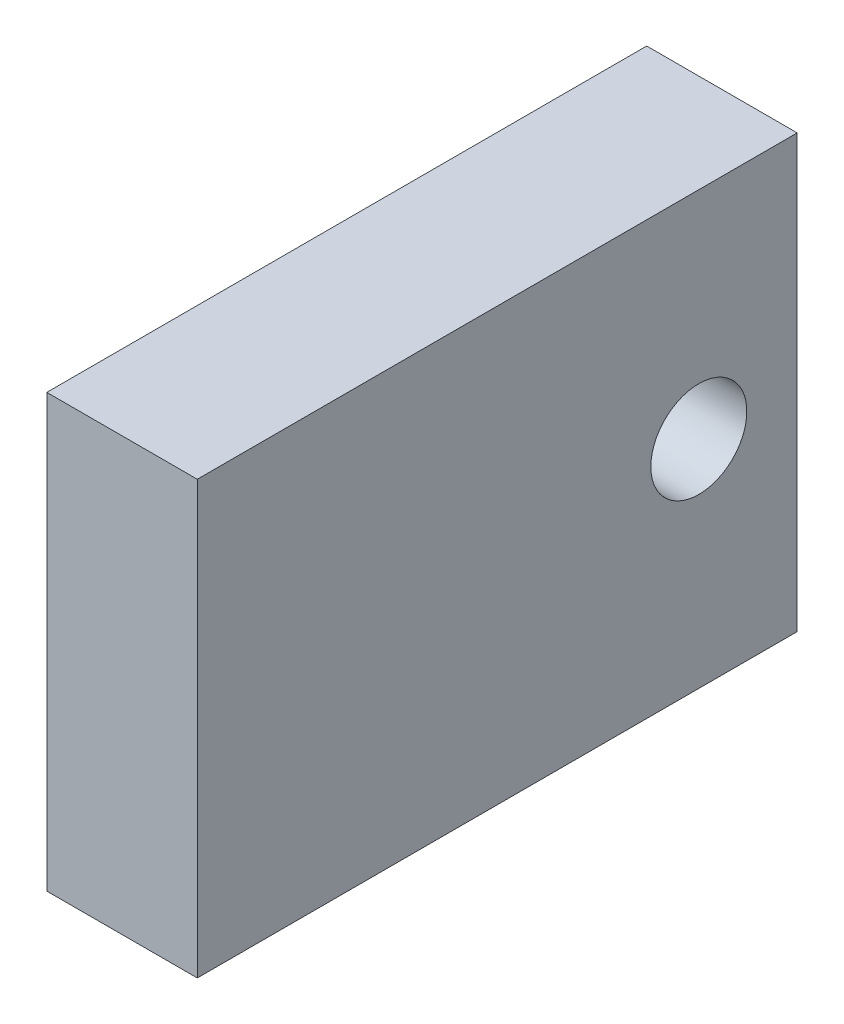
ISO-10303-21;
HEADER;
FILE_DESCRIPTION(('STEP AP214'),'2;1');
FILE_NAME('part.step','',(''),(''),'','','');
FILE_SCHEMA(('AUTOMOTIVE_DESIGN { 1 0 10303 214 1 1 1 1 }'));
ENDSEC;
DATA;
#1=APPLICATION_CONTEXT('core data for automotive mechanical design processes');
#2=APPLICATION_PROTOCOL_DEFINITION('international standard','automotive_design',2000,#1);
#3=PRODUCT_CONTEXT('',#1,'mechanical');
#4=PRODUCT('Part','Part','',(#3));
#5=PRODUCT_RELATED_PRODUCT_CATEGORY('part','',(#4));
#6=PRODUCT_DEFINITION_FORMATION('','',#4);
#7=PRODUCT_DEFINITION_CONTEXT('part definition',#1,'design');
#8=PRODUCT_DEFINITION('design','',#6,#7);
#9=PRODUCT_DEFINITION_SHAPE('','',#8);
#10=(LENGTH_UNIT() NAMED_UNIT(*) SI_UNIT(.MILLI.,.METRE.));
#11=(NAMED_UNIT(*) PLANE_ANGLE_UNIT() SI_UNIT($,.RADIAN.));
#12=(NAMED_UNIT(*) SI_UNIT($,.STERADIAN.) SOLID_ANGLE_UNIT());
#13=UNCERTAINTY_MEASURE_WITH_UNIT(LENGTH_MEASURE(1.E-05),#10,'distance_accuracy_value','');
#14=(GEOMETRIC_REPRESENTATION_CONTEXT(3) GLOBAL_UNCERTAINTY_ASSIGNED_CONTEXT((#13)) GLOBAL_UNIT_ASSIGNED_CONTEXT((#10,
#11,#12)) REPRESENTATION_CONTEXT('',''));
#15=CARTESIAN_POINT('',(0.,0.,0.));
#16=DIRECTION('',(0.,0.,1.));
#17=DIRECTION('',(1.,0.,0.));
#18=AXIS2_PLACEMENT_3D('',#15,#16,#17);
#19=CARTESIAN_POINT('',(-7.964493596,45.72,-31.75));
#20=DIRECTION('',(1.,0.,0.));
#21=DIRECTION('',(0.,0.,-1.));
#22=AXIS2_PLACEMENT_3D('',#19,#20,#21);
#23=PLANE('',#22);
#24=CARTESIAN_POINT('',(-7.964493596,22.86,-21.336));
#25=DIRECTION('',(-1.,0.,0.));
#26=DIRECTION('',(0.,0.,1.));
#27=AXIS2_PLACEMENT_3D('',#24,#25,#26);
#28=CIRCLE('',#27,5.08);
#29=CARTESIAN_POINT('',(-7.964493596,22.86,-16.256));
#30=VERTEX_POINT('',#29);
#31=EDGE_CURVE('E121',#30,#30,#28,.T.);
#32=ORIENTED_EDGE('',*,*,#31,.F.);
#33=EDGE_LOOP('',(#32));
#34=FACE_BOUND('',#33,.T.);
#35=DIRECTION('',(0.,0.,1.));
#36=VECTOR('',#35,1.);
#37=CARTESIAN_POINT('',(-7.964493596,0.,-31.75));
#38=LINE('',#37,#36);
#39=CARTESIAN_POINT('',(-7.964493596,0.,-31.75));
#40=VERTEX_POINT('',#39);
#41=CARTESIAN_POINT('',(-7.96449359599999,0.,31.75));
#42=VERTEX_POINT('',#41);
#43=EDGE_CURVE('E108',#40,#42,#38,.T.);
#44=ORIENTED_EDGE('',*,*,#43,.T.);
#45=DIRECTION('',(0.,-1.,0.));
#46=VECTOR('',#45,1.);
#47=CARTESIAN_POINT('',(-7.96449359599999,45.72,31.75));
#48=LINE('',#47,#46);
#49=CARTESIAN_POINT('',(-7.96449359599999,45.72,31.75));
#50=VERTEX_POINT('',#49);
#51=EDGE_CURVE('E11',#50,#42,#48,.T.);
#52=ORIENTED_EDGE('',*,*,#51,.F.);
#53=DIRECTION('',(0.,0.,1.));
#54=VECTOR('',#53,1.);
#55=CARTESIAN_POINT('',(-7.964493596,45.72,-31.75));
#56=LINE('',#55,#54);
#57=CARTESIAN_POINT('',(-7.964493596,45.72,-31.75));
#58=VERTEX_POINT('',#57);
#59=EDGE_CURVE('E95',#58,#50,#56,.T.);
#60=ORIENTED_EDGE('',*,*,#59,.F.);
#61=DIRECTION('',(0.,-1.,0.));
#62=VECTOR('',#61,1.);
#63=CARTESIAN_POINT('',(-7.964493596,45.72,-31.75));
#64=LINE('',#63,#62);
#65=EDGE_CURVE('E104',#58,#40,#64,.T.);
#66=ORIENTED_EDGE('',*,*,#65,.T.);
#67=EDGE_LOOP('',(#44,#52,#60,#66));
#68=FACE_BOUND('',#67,.T.);
#69=ADVANCED_FACE('F43',(#34,#68),#23,.F.);
#70=CARTESIAN_POINT('',(-7.96449359599999,45.72,31.75));
#71=DIRECTION('',(0.,0.,-1.));
#72=DIRECTION('',(-1.,0.,0.));
#73=AXIS2_PLACEMENT_3D('',#70,#71,#72);
#74=PLANE('',#73);
#75=DIRECTION('',(1.,0.,0.));
#76=VECTOR('',#75,1.);
#77=CARTESIAN_POINT('',(-7.96449359599999,0.,31.75));
#78=LINE('',#77,#76);
#79=CARTESIAN_POINT('',(7.964493596,0.,31.75));
#80=VERTEX_POINT('',#79);
#81=EDGE_CURVE('E99',#42,#80,#78,.T.);
#82=ORIENTED_EDGE('',*,*,#81,.T.);
#83=DIRECTION('',(0.,-1.,0.));
#84=VECTOR('',#83,1.);
#85=CARTESIAN_POINT('',(7.964493596,45.72,31.75));
#86=LINE('',#85,#84);
#87=CARTESIAN_POINT('',(7.964493596,45.72,31.75));
#88=VERTEX_POINT('',#87);
#89=EDGE_CURVE('E52',#88,#80,#86,.T.);
#90=ORIENTED_EDGE('',*,*,#89,.F.);
#91=DIRECTION('',(1.,0.,0.));
#92=VECTOR('',#91,1.);
#93=CARTESIAN_POINT('',(-7.96449359599999,45.72,31.75));
#94=LINE('',#93,#92);
#95=EDGE_CURVE('E90',#50,#88,#94,.T.);
#96=ORIENTED_EDGE('',*,*,#95,.F.);
#97=ORIENTED_EDGE('',*,*,#51,.T.);
#98=EDGE_LOOP('',(#82,#90,#96,#97));
#99=FACE_BOUND('',#98,.T.);
#100=ADVANCED_FACE('F98',(#99),#74,.F.);
#101=CARTESIAN_POINT('',(7.964493596,45.72,-31.75));
#102=DIRECTION('',(-1.,0.,0.));
#103=DIRECTION('',(0.,0.,1.));
#104=AXIS2_PLACEMENT_3D('',#101,#102,#103);
#105=PLANE('',#104);
#106=CARTESIAN_POINT('',(7.964493596,22.86,-21.336));
#107=DIRECTION('',(-1.,0.,0.));
#108=DIRECTION('',(0.,0.,1.));
#109=AXIS2_PLACEMENT_3D('',#106,#107,#108);
#110=CIRCLE('',#109,5.08);
#111=CARTESIAN_POINT('',(7.964493596,22.86,-16.256));
#112=VERTEX_POINT('',#111);
#113=EDGE_CURVE('E46',#112,#112,#110,.T.);
#114=ORIENTED_EDGE('',*,*,#113,.T.);
#115=EDGE_LOOP('',(#114));
#116=FACE_BOUND('',#115,.T.);
#117=DIRECTION('',(0.,0.,-1.));
#118=VECTOR('',#117,1.);
#119=CARTESIAN_POINT('',(7.964493596,0.,-31.75));
#120=LINE('',#119,#118);
#121=CARTESIAN_POINT('',(7.964493596,0.,-31.75));
#122=VERTEX_POINT('',#121);
#123=EDGE_CURVE('E77',#80,#122,#120,.T.);
#124=ORIENTED_EDGE('',*,*,#123,.T.);
#125=DIRECTION('',(0.,-1.,0.));
#126=VECTOR('',#125,1.);
#127=CARTESIAN_POINT('',(7.964493596,45.72,-31.75));
#128=LINE('',#127,#126);
#129=CARTESIAN_POINT('',(7.964493596,45.72,-31.75));
#130=VERTEX_POINT('',#129);
#131=EDGE_CURVE('E100',#130,#122,#128,.T.);
#132=ORIENTED_EDGE('',*,*,#131,.F.);
#133=DIRECTION('',(0.,0.,-1.));
#134=VECTOR('',#133,1.);
#135=CARTESIAN_POINT('',(7.964493596,45.72,-31.75));
#136=LINE('',#135,#134);
#137=EDGE_CURVE('E93',#88,#130,#136,.T.);
#138=ORIENTED_EDGE('',*,*,#137,.F.);
#139=ORIENTED_EDGE('',*,*,#89,.T.);
#140=EDGE_LOOP('',(#124,#132,#138,#139));
#141=FACE_BOUND('',#140,.T.);
#142=ADVANCED_FACE('F102',(#116,#141),#105,.F.);
#143=CARTESIAN_POINT('',(-7.964493596,45.72,-31.75));
#144=DIRECTION('',(0.,0.,1.));
#145=DIRECTION('',(1.,0.,0.));
#146=AXIS2_PLACEMENT_3D('',#143,#144,#145);
#147=PLANE('',#146);
#148=DIRECTION('',(-1.,0.,0.));
#149=VECTOR('',#148,1.);
#150=CARTESIAN_POINT('',(-7.964493596,0.,-31.75));
#151=LINE('',#150,#149);
#152=EDGE_CURVE('E83',#122,#40,#151,.T.);
#153=ORIENTED_EDGE('',*,*,#152,.T.);
#154=ORIENTED_EDGE('',*,*,#65,.F.);
#155=DIRECTION('',(-1.,0.,0.));
#156=VECTOR('',#155,1.);
#157=CARTESIAN_POINT('',(-7.964493596,45.72,-31.75));
#158=LINE('',#157,#156);
#159=EDGE_CURVE('E60',#130,#58,#158,.T.);
#160=ORIENTED_EDGE('',*,*,#159,.F.);
#161=ORIENTED_EDGE('',*,*,#131,.T.);
#162=EDGE_LOOP('',(#153,#154,#160,#161));
#163=FACE_BOUND('',#162,.T.);
#164=ADVANCED_FACE('F115',(#163),#147,.F.);
#165=CARTESIAN_POINT('',(0.,45.72,0.));
#166=DIRECTION('',(0.,1.,0.));
#167=DIRECTION('',(0.,0.,1.));
#168=AXIS2_PLACEMENT_3D('',#165,#166,#167);
#169=PLANE('',#168);
#170=ORIENTED_EDGE('',*,*,#59,.T.);
#171=ORIENTED_EDGE('',*,*,#95,.T.);
#172=ORIENTED_EDGE('',*,*,#137,.T.);
#173=ORIENTED_EDGE('',*,*,#159,.T.);
#174=EDGE_LOOP('',(#170,#171,#172,#173));
#175=FACE_BOUND('',#174,.T.);
#176=ADVANCED_FACE('F91',(#175),#169,.T.);
#177=CARTESIAN_POINT('',(0.,0.,0.));
#178=DIRECTION('',(0.,1.,0.));
#179=DIRECTION('',(0.,0.,1.));
#180=AXIS2_PLACEMENT_3D('',#177,#178,#179);
#181=PLANE('',#180);
#182=ORIENTED_EDGE('',*,*,#43,.F.);
#183=ORIENTED_EDGE('',*,*,#152,.F.);
#184=ORIENTED_EDGE('',*,*,#123,.F.);
#185=ORIENTED_EDGE('',*,*,#81,.F.);
#186=EDGE_LOOP('',(#182,#183,#184,#185));
#187=FACE_BOUND('',#186,.T.);
#188=ADVANCED_FACE('F118',(#187),#181,.F.);
#189=CARTESIAN_POINT('',(42.835506404,22.86,-21.336));
#190=DIRECTION('',(-1.,0.,0.));
#191=DIRECTION('',(0.,0.,1.));
#192=AXIS2_PLACEMENT_3D('',#189,#190,#191);
#193=CYLINDRICAL_SURFACE('',#192,5.08);
#194=ORIENTED_EDGE('',*,*,#31,.T.);
#195=EDGE_LOOP('',(#194));
#196=FACE_BOUND('',#195,.T.);
#197=ORIENTED_EDGE('',*,*,#113,.F.);
#198=EDGE_LOOP('',(#197));
#199=FACE_BOUND('',#198,.T.);
#200=ADVANCED_FACE('F129',(#196,#199),#193,.F.);
#201=CLOSED_SHELL('',(#69,#100,#142,#164,#176,#188,#200));
#202=MANIFOLD_SOLID_BREP('B2',#201);
#203=ADVANCED_BREP_SHAPE_REPRESENTATION('',(#18,#202),#14);
#204=SHAPE_DEFINITION_REPRESENTATION(#9,#203);
ENDSEC;
END-ISO-10303-21;
